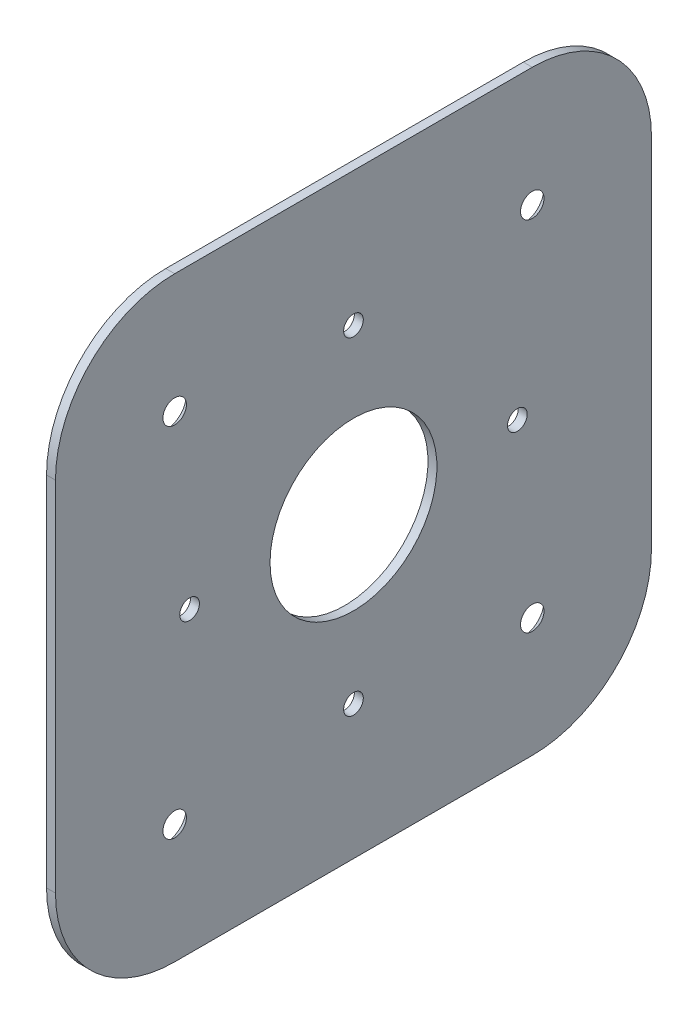
ISO-10303-21;
HEADER;
FILE_DESCRIPTION(('STEP AP214'),'2;1');
FILE_NAME('part.step','',(''),(''),'','','');
FILE_SCHEMA(('AUTOMOTIVE_DESIGN { 1 0 10303 214 1 1 1 1 }'));
ENDSEC;
DATA;
#1=APPLICATION_CONTEXT('core data for automotive mechanical design processes');
#2=APPLICATION_PROTOCOL_DEFINITION('international standard','automotive_design',2000,#1);
#3=PRODUCT_CONTEXT('',#1,'mechanical');
#4=PRODUCT('Part','Part','',(#3));
#5=PRODUCT_RELATED_PRODUCT_CATEGORY('part','',(#4));
#6=PRODUCT_DEFINITION_FORMATION('','',#4);
#7=PRODUCT_DEFINITION_CONTEXT('part definition',#1,'design');
#8=PRODUCT_DEFINITION('design','',#6,#7);
#9=PRODUCT_DEFINITION_SHAPE('','',#8);
#10=(LENGTH_UNIT() NAMED_UNIT(*) SI_UNIT(.MILLI.,.METRE.));
#11=(NAMED_UNIT(*) PLANE_ANGLE_UNIT() SI_UNIT($,.RADIAN.));
#12=(NAMED_UNIT(*) SI_UNIT($,.STERADIAN.) SOLID_ANGLE_UNIT());
#13=UNCERTAINTY_MEASURE_WITH_UNIT(LENGTH_MEASURE(1.E-05),#10,'distance_accuracy_value','');
#14=(GEOMETRIC_REPRESENTATION_CONTEXT(3) GLOBAL_UNCERTAINTY_ASSIGNED_CONTEXT((#13)) GLOBAL_UNIT_ASSIGNED_CONTEXT((#10,
#11,#12)) REPRESENTATION_CONTEXT('',''));
#15=CARTESIAN_POINT('',(0.,0.,0.));
#16=DIRECTION('',(0.,0.,1.));
#17=DIRECTION('',(1.,0.,0.));
#18=AXIS2_PLACEMENT_3D('',#15,#16,#17);
#19=CARTESIAN_POINT('',(0.,-30.,30.));
#20=DIRECTION('',(-1.,0.,0.));
#21=DIRECTION('',(0.,0.,1.));
#22=AXIS2_PLACEMENT_3D('',#19,#20,#21);
#23=PLANE('',#22);
#24=CARTESIAN_POINT('',(0.,2.88047377291524E-13,27.5));
#25=DIRECTION('',(-1.,0.,0.));
#26=DIRECTION('',(0.,0.,1.));
#27=AXIS2_PLACEMENT_3D('',#24,#25,#26);
#28=CIRCLE('',#27,1.65);
#29=CARTESIAN_POINT('',(0.,2.88047377291524E-13,29.15));
#30=VERTEX_POINT('',#29);
#31=EDGE_CURVE('E265',#30,#30,#28,.T.);
#32=ORIENTED_EDGE('',*,*,#31,.T.);
#33=EDGE_LOOP('',(#32));
#34=FACE_BOUND('',#33,.T.);
#35=CARTESIAN_POINT('',(0.,-27.5,0.));
#36=DIRECTION('',(-1.,0.,0.));
#37=DIRECTION('',(0.,0.,1.));
#38=AXIS2_PLACEMENT_3D('',#35,#36,#37);
#39=CIRCLE('',#38,1.65);
#40=CARTESIAN_POINT('',(0.,-27.5,1.65));
#41=VERTEX_POINT('',#40);
#42=EDGE_CURVE('E275',#41,#41,#39,.T.);
#43=ORIENTED_EDGE('',*,*,#42,.T.);
#44=EDGE_LOOP('',(#43));
#45=FACE_BOUND('',#44,.T.);
#46=CARTESIAN_POINT('',(0.,0.,-27.5));
#47=DIRECTION('',(-1.,0.,0.));
#48=DIRECTION('',(0.,0.,1.));
#49=AXIS2_PLACEMENT_3D('',#46,#47,#48);
#50=CIRCLE('',#49,1.65);
#51=CARTESIAN_POINT('',(0.,0.,-25.85));
#52=VERTEX_POINT('',#51);
#53=EDGE_CURVE('E281',#52,#52,#50,.T.);
#54=ORIENTED_EDGE('',*,*,#53,.T.);
#55=EDGE_LOOP('',(#54));
#56=FACE_BOUND('',#55,.T.);
#57=CARTESIAN_POINT('',(0.,27.5,0.));
#58=DIRECTION('',(-1.,0.,0.));
#59=DIRECTION('',(0.,0.,1.));
#60=AXIS2_PLACEMENT_3D('',#57,#58,#59);
#61=CIRCLE('',#60,1.65);
#62=CARTESIAN_POINT('',(0.,27.5,1.65));
#63=VERTEX_POINT('',#62);
#64=EDGE_CURVE('E287',#63,#63,#61,.T.);
#65=ORIENTED_EDGE('',*,*,#64,.T.);
#66=EDGE_LOOP('',(#65));
#67=FACE_BOUND('',#66,.T.);
#68=CARTESIAN_POINT('',(0.,0.,0.));
#69=DIRECTION('',(-1.,0.,0.));
#70=DIRECTION('',(0.,0.,1.));
#71=AXIS2_PLACEMENT_3D('',#68,#69,#70);
#72=CIRCLE('',#71,14.);
#73=CARTESIAN_POINT('',(0.,0.,14.));
#74=VERTEX_POINT('',#73);
#75=EDGE_CURVE('E293',#74,#74,#72,.T.);
#76=ORIENTED_EDGE('',*,*,#75,.T.);
#77=EDGE_LOOP('',(#76));
#78=FACE_BOUND('',#77,.T.);
#79=CARTESIAN_POINT('',(0.,30.,-30.));
#80=DIRECTION('',(-1.,0.,0.));
#81=DIRECTION('',(0.,0.,1.));
#82=AXIS2_PLACEMENT_3D('',#79,#80,#81);
#83=CIRCLE('',#82,1.97);
#84=CARTESIAN_POINT('',(0.,30.,-28.03));
#85=VERTEX_POINT('',#84);
#86=EDGE_CURVE('E298',#85,#85,#83,.T.);
#87=ORIENTED_EDGE('',*,*,#86,.T.);
#88=EDGE_LOOP('',(#87));
#89=FACE_BOUND('',#88,.T.);
#90=CARTESIAN_POINT('',(0.,30.,30.));
#91=DIRECTION('',(-1.,0.,0.));
#92=DIRECTION('',(0.,0.,1.));
#93=AXIS2_PLACEMENT_3D('',#90,#91,#92);
#94=CIRCLE('',#93,1.97);
#95=CARTESIAN_POINT('',(0.,30.,31.97));
#96=VERTEX_POINT('',#95);
#97=EDGE_CURVE('E45',#96,#96,#94,.T.);
#98=ORIENTED_EDGE('',*,*,#97,.T.);
#99=EDGE_LOOP('',(#98));
#100=FACE_BOUND('',#99,.T.);
#101=CARTESIAN_POINT('',(0.,-30.,30.));
#102=DIRECTION('',(1.,0.,0.));
#103=DIRECTION('',(0.,0.,1.));
#104=AXIS2_PLACEMENT_3D('',#101,#102,#103);
#105=CIRCLE('',#104,20.);
#106=CARTESIAN_POINT('',(0.,-29.9999999999999,50.));
#107=VERTEX_POINT('',#106);
#108=CARTESIAN_POINT('',(0.,-50.,29.9999999999999));
#109=VERTEX_POINT('',#108);
#110=EDGE_CURVE('E140',#107,#109,#105,.T.);
#111=ORIENTED_EDGE('',*,*,#110,.T.);
#112=DIRECTION('',(0.,0.,-1.));
#113=VECTOR('',#112,1.);
#114=CARTESIAN_POINT('',(0.,-50.,29.9999999999999));
#115=LINE('',#114,#113);
#116=CARTESIAN_POINT('',(0.,-50.,-29.9999999999999));
#117=VERTEX_POINT('',#116);
#118=EDGE_CURVE('E143',#109,#117,#115,.T.);
#119=ORIENTED_EDGE('',*,*,#118,.T.);
#120=CARTESIAN_POINT('',(0.,-30.,-30.));
#121=DIRECTION('',(1.,0.,0.));
#122=DIRECTION('',(0.,0.,-1.));
#123=AXIS2_PLACEMENT_3D('',#120,#121,#122);
#124=CIRCLE('',#123,20.);
#125=CARTESIAN_POINT('',(0.,-29.9999999999999,-50.));
#126=VERTEX_POINT('',#125);
#127=EDGE_CURVE('E147',#117,#126,#124,.T.);
#128=ORIENTED_EDGE('',*,*,#127,.T.);
#129=DIRECTION('',(0.,1.,0.));
#130=VECTOR('',#129,1.);
#131=CARTESIAN_POINT('',(0.,-29.9999999999999,-50.));
#132=LINE('',#131,#130);
#133=CARTESIAN_POINT('',(0.,29.9999999999998,-50.));
#134=VERTEX_POINT('',#133);
#135=EDGE_CURVE('E150',#126,#134,#132,.T.);
#136=ORIENTED_EDGE('',*,*,#135,.T.);
#137=CARTESIAN_POINT('',(0.,30.,-30.));
#138=DIRECTION('',(1.,0.,0.));
#139=DIRECTION('',(0.,0.,1.));
#140=AXIS2_PLACEMENT_3D('',#137,#138,#139);
#141=CIRCLE('',#140,20.);
#142=CARTESIAN_POINT('',(0.,50.,-29.9999999999999));
#143=VERTEX_POINT('',#142);
#144=EDGE_CURVE('E153',#134,#143,#141,.T.);
#145=ORIENTED_EDGE('',*,*,#144,.T.);
#146=DIRECTION('',(0.,0.,1.));
#147=VECTOR('',#146,1.);
#148=CARTESIAN_POINT('',(0.,50.,29.9999999999999));
#149=LINE('',#148,#147);
#150=CARTESIAN_POINT('',(0.,50.,29.9999999999999));
#151=VERTEX_POINT('',#150);
#152=EDGE_CURVE('E156',#143,#151,#149,.T.);
#153=ORIENTED_EDGE('',*,*,#152,.T.);
#154=CARTESIAN_POINT('',(0.,30.,30.));
#155=DIRECTION('',(1.,0.,0.));
#156=DIRECTION('',(0.,0.,1.));
#157=AXIS2_PLACEMENT_3D('',#154,#155,#156);
#158=CIRCLE('',#157,20.);
#159=CARTESIAN_POINT('',(0.,29.9999999999999,50.));
#160=VERTEX_POINT('',#159);
#161=EDGE_CURVE('E117',#151,#160,#158,.T.);
#162=ORIENTED_EDGE('',*,*,#161,.T.);
#163=DIRECTION('',(0.,-1.,0.));
#164=VECTOR('',#163,1.);
#165=CARTESIAN_POINT('',(0.,-29.9999999999999,50.));
#166=LINE('',#165,#164);
#167=EDGE_CURVE('E159',#160,#107,#166,.T.);
#168=ORIENTED_EDGE('',*,*,#167,.T.);
#169=EDGE_LOOP('',(#111,#119,#128,#136,#145,#153,#162,#168));
#170=FACE_BOUND('',#169,.T.);
#171=CARTESIAN_POINT('',(0.,-30.,-30.));
#172=DIRECTION('',(-1.,0.,0.));
#173=DIRECTION('',(0.,0.,1.));
#174=AXIS2_PLACEMENT_3D('',#171,#172,#173);
#175=CIRCLE('',#174,1.97);
#176=CARTESIAN_POINT('',(0.,-30.,-28.03));
#177=VERTEX_POINT('',#176);
#178=EDGE_CURVE('E144',#177,#177,#175,.T.);
#179=ORIENTED_EDGE('',*,*,#178,.T.);
#180=EDGE_LOOP('',(#179));
#181=FACE_BOUND('',#180,.T.);
#182=CARTESIAN_POINT('',(0.,-30.,30.));
#183=DIRECTION('',(-1.,0.,0.));
#184=DIRECTION('',(0.,0.,1.));
#185=AXIS2_PLACEMENT_3D('',#182,#183,#184);
#186=CIRCLE('',#185,1.97);
#187=CARTESIAN_POINT('',(0.,-30.,31.97));
#188=VERTEX_POINT('',#187);
#189=EDGE_CURVE('E174',#188,#188,#186,.T.);
#190=ORIENTED_EDGE('',*,*,#189,.T.);
#191=EDGE_LOOP('',(#190));
#192=FACE_BOUND('',#191,.T.);
#193=ADVANCED_FACE('F41',(#34,#45,#56,#67,#78,#89,#100,#170,#181,#192),#23,.F.);
#194=CARTESIAN_POINT('',(-1.5,-30.,30.));
#195=DIRECTION('',(1.,0.,0.));
#196=DIRECTION('',(0.,0.,-1.));
#197=AXIS2_PLACEMENT_3D('',#194,#195,#196);
#198=CYLINDRICAL_SURFACE('',#197,20.);
#199=ORIENTED_EDGE('',*,*,#110,.F.);
#200=DIRECTION('',(1.,0.,0.));
#201=VECTOR('',#200,1.);
#202=CARTESIAN_POINT('',(-1.5,-29.9999999999999,50.));
#203=LINE('',#202,#201);
#204=CARTESIAN_POINT('',(-1.5,-29.9999999999999,50.));
#205=VERTEX_POINT('',#204);
#206=EDGE_CURVE('E11',#205,#107,#203,.T.);
#207=ORIENTED_EDGE('',*,*,#206,.F.);
#208=CARTESIAN_POINT('',(-1.5,-30.,30.));
#209=DIRECTION('',(1.,0.,0.));
#210=DIRECTION('',(0.,0.,1.));
#211=AXIS2_PLACEMENT_3D('',#208,#209,#210);
#212=CIRCLE('',#211,20.);
#213=CARTESIAN_POINT('',(-1.5,-50.,29.9999999999999));
#214=VERTEX_POINT('',#213);
#215=EDGE_CURVE('E161',#205,#214,#212,.T.);
#216=ORIENTED_EDGE('',*,*,#215,.T.);
#217=DIRECTION('',(1.,0.,0.));
#218=VECTOR('',#217,1.);
#219=CARTESIAN_POINT('',(-1.5,-50.,29.9999999999999));
#220=LINE('',#219,#218);
#221=EDGE_CURVE('E98',#214,#109,#220,.T.);
#222=ORIENTED_EDGE('',*,*,#221,.T.);
#223=EDGE_LOOP('',(#199,#207,#216,#222));
#224=FACE_BOUND('',#223,.T.);
#225=ADVANCED_FACE('F43',(#224),#198,.T.);
#226=CARTESIAN_POINT('',(-1.5,-29.9999999999999,50.));
#227=DIRECTION('',(0.,0.,1.));
#228=DIRECTION('',(1.,0.,0.));
#229=AXIS2_PLACEMENT_3D('',#226,#227,#228);
#230=PLANE('',#229);
#231=ORIENTED_EDGE('',*,*,#167,.F.);
#232=DIRECTION('',(1.,0.,0.));
#233=VECTOR('',#232,1.);
#234=CARTESIAN_POINT('',(-1.5,29.9999999999999,50.));
#235=LINE('',#234,#233);
#236=CARTESIAN_POINT('',(-1.5,29.9999999999999,50.));
#237=VERTEX_POINT('',#236);
#238=EDGE_CURVE('E51',#237,#160,#235,.T.);
#239=ORIENTED_EDGE('',*,*,#238,.F.);
#240=DIRECTION('',(0.,-1.,0.));
#241=VECTOR('',#240,1.);
#242=CARTESIAN_POINT('',(-1.5,-29.9999999999999,50.));
#243=LINE('',#242,#241);
#244=EDGE_CURVE('E130',#237,#205,#243,.T.);
#245=ORIENTED_EDGE('',*,*,#244,.T.);
#246=ORIENTED_EDGE('',*,*,#206,.T.);
#247=EDGE_LOOP('',(#231,#239,#245,#246));
#248=FACE_BOUND('',#247,.T.);
#249=ADVANCED_FACE('F208',(#248),#230,.T.);
#250=CARTESIAN_POINT('',(-1.5,30.,30.));
#251=DIRECTION('',(1.,0.,0.));
#252=DIRECTION('',(0.,0.,-1.));
#253=AXIS2_PLACEMENT_3D('',#250,#251,#252);
#254=CYLINDRICAL_SURFACE('',#253,20.);
#255=ORIENTED_EDGE('',*,*,#161,.F.);
#256=DIRECTION('',(1.,0.,0.));
#257=VECTOR('',#256,1.);
#258=CARTESIAN_POINT('',(-1.5,50.,29.9999999999999));
#259=LINE('',#258,#257);
#260=CARTESIAN_POINT('',(-1.5,50.,29.9999999999999));
#261=VERTEX_POINT('',#260);
#262=EDGE_CURVE('E112',#261,#151,#259,.T.);
#263=ORIENTED_EDGE('',*,*,#262,.F.);
#264=CARTESIAN_POINT('',(-1.5,30.,30.));
#265=DIRECTION('',(1.,0.,0.));
#266=DIRECTION('',(0.,0.,1.));
#267=AXIS2_PLACEMENT_3D('',#264,#265,#266);
#268=CIRCLE('',#267,20.);
#269=EDGE_CURVE('E115',#261,#237,#268,.T.);
#270=ORIENTED_EDGE('',*,*,#269,.T.);
#271=ORIENTED_EDGE('',*,*,#238,.T.);
#272=EDGE_LOOP('',(#255,#263,#270,#271));
#273=FACE_BOUND('',#272,.T.);
#274=ADVANCED_FACE('F114',(#273),#254,.T.);
#275=CARTESIAN_POINT('',(-1.5,50.,29.9999999999999));
#276=DIRECTION('',(0.,1.,0.));
#277=DIRECTION('',(0.,0.,1.));
#278=AXIS2_PLACEMENT_3D('',#275,#276,#277);
#279=PLANE('',#278);
#280=ORIENTED_EDGE('',*,*,#152,.F.);
#281=DIRECTION('',(1.,0.,0.));
#282=VECTOR('',#281,1.);
#283=CARTESIAN_POINT('',(-1.5,50.,-29.9999999999999));
#284=LINE('',#283,#282);
#285=CARTESIAN_POINT('',(-1.5,50.,-29.9999999999999));
#286=VERTEX_POINT('',#285);
#287=EDGE_CURVE('E122',#286,#143,#284,.T.);
#288=ORIENTED_EDGE('',*,*,#287,.F.);
#289=DIRECTION('',(0.,0.,1.));
#290=VECTOR('',#289,1.);
#291=CARTESIAN_POINT('',(-1.5,50.,29.9999999999999));
#292=LINE('',#291,#290);
#293=EDGE_CURVE('E128',#286,#261,#292,.T.);
#294=ORIENTED_EDGE('',*,*,#293,.T.);
#295=ORIENTED_EDGE('',*,*,#262,.T.);
#296=EDGE_LOOP('',(#280,#288,#294,#295));
#297=FACE_BOUND('',#296,.T.);
#298=ADVANCED_FACE('F132',(#297),#279,.T.);
#299=CARTESIAN_POINT('',(-1.5,30.,-30.));
#300=DIRECTION('',(1.,0.,0.));
#301=DIRECTION('',(0.,0.,-1.));
#302=AXIS2_PLACEMENT_3D('',#299,#300,#301);
#303=CYLINDRICAL_SURFACE('',#302,20.);
#304=ORIENTED_EDGE('',*,*,#144,.F.);
#305=DIRECTION('',(1.,0.,0.));
#306=VECTOR('',#305,1.);
#307=CARTESIAN_POINT('',(-1.5,29.9999999999998,-50.));
#308=LINE('',#307,#306);
#309=CARTESIAN_POINT('',(-1.5,29.9999999999998,-50.));
#310=VERTEX_POINT('',#309);
#311=EDGE_CURVE('E165',#310,#134,#308,.T.);
#312=ORIENTED_EDGE('',*,*,#311,.F.);
#313=CARTESIAN_POINT('',(-1.5,30.,-30.));
#314=DIRECTION('',(1.,0.,0.));
#315=DIRECTION('',(0.,0.,1.));
#316=AXIS2_PLACEMENT_3D('',#313,#314,#315);
#317=CIRCLE('',#316,20.);
#318=EDGE_CURVE('E133',#310,#286,#317,.T.);
#319=ORIENTED_EDGE('',*,*,#318,.T.);
#320=ORIENTED_EDGE('',*,*,#287,.T.);
#321=EDGE_LOOP('',(#304,#312,#319,#320));
#322=FACE_BOUND('',#321,.T.);
#323=ADVANCED_FACE('F388',(#322),#303,.T.);
#324=CARTESIAN_POINT('',(-1.5,-29.9999999999999,-50.));
#325=DIRECTION('',(0.,0.,-1.));
#326=DIRECTION('',(-1.,0.,0.));
#327=AXIS2_PLACEMENT_3D('',#324,#325,#326);
#328=PLANE('',#327);
#329=ORIENTED_EDGE('',*,*,#135,.F.);
#330=DIRECTION('',(1.,0.,0.));
#331=VECTOR('',#330,1.);
#332=CARTESIAN_POINT('',(-1.5,-29.9999999999999,-50.));
#333=LINE('',#332,#331);
#334=CARTESIAN_POINT('',(-1.5,-29.9999999999999,-50.));
#335=VERTEX_POINT('',#334);
#336=EDGE_CURVE('E167',#335,#126,#333,.T.);
#337=ORIENTED_EDGE('',*,*,#336,.F.);
#338=DIRECTION('',(0.,1.,0.));
#339=VECTOR('',#338,1.);
#340=CARTESIAN_POINT('',(-1.5,-29.9999999999999,-50.));
#341=LINE('',#340,#339);
#342=EDGE_CURVE('E135',#335,#310,#341,.T.);
#343=ORIENTED_EDGE('',*,*,#342,.T.);
#344=ORIENTED_EDGE('',*,*,#311,.T.);
#345=EDGE_LOOP('',(#329,#337,#343,#344));
#346=FACE_BOUND('',#345,.T.);
#347=ADVANCED_FACE('F199',(#346),#328,.T.);
#348=CARTESIAN_POINT('',(-1.5,-30.,-30.));
#349=DIRECTION('',(1.,0.,0.));
#350=DIRECTION('',(0.,0.,-1.));
#351=AXIS2_PLACEMENT_3D('',#348,#349,#350);
#352=CYLINDRICAL_SURFACE('',#351,20.);
#353=ORIENTED_EDGE('',*,*,#127,.F.);
#354=DIRECTION('',(1.,0.,0.));
#355=VECTOR('',#354,1.);
#356=CARTESIAN_POINT('',(-1.5,-50.,-29.9999999999999));
#357=LINE('',#356,#355);
#358=CARTESIAN_POINT('',(-1.5,-50.,-29.9999999999999));
#359=VERTEX_POINT('',#358);
#360=EDGE_CURVE('E169',#359,#117,#357,.T.);
#361=ORIENTED_EDGE('',*,*,#360,.F.);
#362=CARTESIAN_POINT('',(-1.5,-30.,-30.));
#363=DIRECTION('',(1.,0.,0.));
#364=DIRECTION('',(0.,0.,-1.));
#365=AXIS2_PLACEMENT_3D('',#362,#363,#364);
#366=CIRCLE('',#365,20.);
#367=EDGE_CURVE('E193',#359,#335,#366,.T.);
#368=ORIENTED_EDGE('',*,*,#367,.T.);
#369=ORIENTED_EDGE('',*,*,#336,.T.);
#370=EDGE_LOOP('',(#353,#361,#368,#369));
#371=FACE_BOUND('',#370,.T.);
#372=ADVANCED_FACE('F204',(#371),#352,.T.);
#373=CARTESIAN_POINT('',(-1.5,-50.,29.9999999999999));
#374=DIRECTION('',(0.,-1.,0.));
#375=DIRECTION('',(0.,0.,-1.));
#376=AXIS2_PLACEMENT_3D('',#373,#374,#375);
#377=PLANE('',#376);
#378=ORIENTED_EDGE('',*,*,#118,.F.);
#379=ORIENTED_EDGE('',*,*,#221,.F.);
#380=DIRECTION('',(0.,0.,-1.));
#381=VECTOR('',#380,1.);
#382=CARTESIAN_POINT('',(-1.5,-50.,29.9999999999999));
#383=LINE('',#382,#381);
#384=EDGE_CURVE('E191',#214,#359,#383,.T.);
#385=ORIENTED_EDGE('',*,*,#384,.T.);
#386=ORIENTED_EDGE('',*,*,#360,.T.);
#387=EDGE_LOOP('',(#378,#379,#385,#386));
#388=FACE_BOUND('',#387,.T.);
#389=ADVANCED_FACE('F205',(#388),#377,.T.);
#390=CARTESIAN_POINT('',(-1.5,-30.,30.));
#391=DIRECTION('',(-1.,0.,0.));
#392=DIRECTION('',(0.,0.,1.));
#393=AXIS2_PLACEMENT_3D('',#390,#391,#392);
#394=PLANE('',#393);
#395=CARTESIAN_POINT('',(-1.5,2.88047377291524E-13,27.5));
#396=DIRECTION('',(-1.,0.,0.));
#397=DIRECTION('',(0.,0.,1.));
#398=AXIS2_PLACEMENT_3D('',#395,#396,#397);
#399=CIRCLE('',#398,1.64999999999999);
#400=CARTESIAN_POINT('',(-1.5,2.88047377291524E-13,29.15));
#401=VERTEX_POINT('',#400);
#402=EDGE_CURVE('E268',#401,#401,#399,.T.);
#403=ORIENTED_EDGE('',*,*,#402,.F.);
#404=EDGE_LOOP('',(#403));
#405=FACE_BOUND('',#404,.T.);
#406=CARTESIAN_POINT('',(-1.5,-27.5,0.));
#407=DIRECTION('',(-1.,0.,0.));
#408=DIRECTION('',(0.,0.,1.));
#409=AXIS2_PLACEMENT_3D('',#406,#407,#408);
#410=CIRCLE('',#409,1.64999999999999);
#411=CARTESIAN_POINT('',(-1.5,-27.5,1.64999999999999));
#412=VERTEX_POINT('',#411);
#413=EDGE_CURVE('E270',#412,#412,#410,.T.);
#414=ORIENTED_EDGE('',*,*,#413,.F.);
#415=EDGE_LOOP('',(#414));
#416=FACE_BOUND('',#415,.T.);
#417=CARTESIAN_POINT('',(-1.5,0.,-27.5));
#418=DIRECTION('',(-1.,0.,0.));
#419=DIRECTION('',(0.,0.,1.));
#420=AXIS2_PLACEMENT_3D('',#417,#418,#419);
#421=CIRCLE('',#420,1.64999999999999);
#422=CARTESIAN_POINT('',(-1.5,0.,-25.85));
#423=VERTEX_POINT('',#422);
#424=EDGE_CURVE('E278',#423,#423,#421,.T.);
#425=ORIENTED_EDGE('',*,*,#424,.F.);
#426=EDGE_LOOP('',(#425));
#427=FACE_BOUND('',#426,.T.);
#428=CARTESIAN_POINT('',(-1.5,27.5,0.));
#429=DIRECTION('',(-1.,0.,0.));
#430=DIRECTION('',(0.,0.,1.));
#431=AXIS2_PLACEMENT_3D('',#428,#429,#430);
#432=CIRCLE('',#431,1.64999999999999);
#433=CARTESIAN_POINT('',(-1.5,27.5,1.64999999999999));
#434=VERTEX_POINT('',#433);
#435=EDGE_CURVE('E284',#434,#434,#432,.T.);
#436=ORIENTED_EDGE('',*,*,#435,.F.);
#437=EDGE_LOOP('',(#436));
#438=FACE_BOUND('',#437,.T.);
#439=CARTESIAN_POINT('',(-1.5,0.,0.));
#440=DIRECTION('',(-1.,0.,0.));
#441=DIRECTION('',(0.,0.,1.));
#442=AXIS2_PLACEMENT_3D('',#439,#440,#441);
#443=CIRCLE('',#442,14.);
#444=CARTESIAN_POINT('',(-1.5,0.,14.));
#445=VERTEX_POINT('',#444);
#446=EDGE_CURVE('E290',#445,#445,#443,.T.);
#447=ORIENTED_EDGE('',*,*,#446,.F.);
#448=EDGE_LOOP('',(#447));
#449=FACE_BOUND('',#448,.T.);
#450=CARTESIAN_POINT('',(-1.5,30.,-30.));
#451=DIRECTION('',(-1.,0.,0.));
#452=DIRECTION('',(0.,0.,1.));
#453=AXIS2_PLACEMENT_3D('',#450,#451,#452);
#454=CIRCLE('',#453,3.47);
#455=CARTESIAN_POINT('',(-1.5,30.,-26.53));
#456=VERTEX_POINT('',#455);
#457=EDGE_CURVE('E296',#456,#456,#454,.T.);
#458=ORIENTED_EDGE('',*,*,#457,.F.);
#459=EDGE_LOOP('',(#458));
#460=FACE_BOUND('',#459,.T.);
#461=CARTESIAN_POINT('',(-1.5,30.,30.));
#462=DIRECTION('',(-1.,0.,0.));
#463=DIRECTION('',(0.,0.,1.));
#464=AXIS2_PLACEMENT_3D('',#461,#462,#463);
#465=CIRCLE('',#464,3.47);
#466=CARTESIAN_POINT('',(-1.5,30.,33.47));
#467=VERTEX_POINT('',#466);
#468=EDGE_CURVE('E186',#467,#467,#465,.T.);
#469=ORIENTED_EDGE('',*,*,#468,.F.);
#470=EDGE_LOOP('',(#469));
#471=FACE_BOUND('',#470,.T.);
#472=CARTESIAN_POINT('',(-1.5,-30.,30.));
#473=DIRECTION('',(-1.,0.,0.));
#474=DIRECTION('',(0.,0.,1.));
#475=AXIS2_PLACEMENT_3D('',#472,#473,#474);
#476=CIRCLE('',#475,3.47);
#477=CARTESIAN_POINT('',(-1.5,-30.,33.47));
#478=VERTEX_POINT('',#477);
#479=EDGE_CURVE('E176',#478,#478,#476,.T.);
#480=ORIENTED_EDGE('',*,*,#479,.F.);
#481=EDGE_LOOP('',(#480));
#482=FACE_BOUND('',#481,.T.);
#483=CARTESIAN_POINT('',(-1.5,-30.,-30.));
#484=DIRECTION('',(-1.,0.,0.));
#485=DIRECTION('',(0.,0.,1.));
#486=AXIS2_PLACEMENT_3D('',#483,#484,#485);
#487=CIRCLE('',#486,3.47);
#488=CARTESIAN_POINT('',(-1.5,-30.,-26.53));
#489=VERTEX_POINT('',#488);
#490=EDGE_CURVE('E173',#489,#489,#487,.T.);
#491=ORIENTED_EDGE('',*,*,#490,.F.);
#492=EDGE_LOOP('',(#491));
#493=FACE_BOUND('',#492,.T.);
#494=ORIENTED_EDGE('',*,*,#215,.F.);
#495=ORIENTED_EDGE('',*,*,#244,.F.);
#496=ORIENTED_EDGE('',*,*,#269,.F.);
#497=ORIENTED_EDGE('',*,*,#293,.F.);
#498=ORIENTED_EDGE('',*,*,#318,.F.);
#499=ORIENTED_EDGE('',*,*,#342,.F.);
#500=ORIENTED_EDGE('',*,*,#367,.F.);
#501=ORIENTED_EDGE('',*,*,#384,.F.);
#502=EDGE_LOOP('',(#494,#495,#496,#497,#498,#499,#500,#501));
#503=FACE_BOUND('',#502,.T.);
#504=ADVANCED_FACE('F126',(#405,#416,#427,#438,#449,#460,#471,#482,#493,#503),#394,.T.);
#505=CARTESIAN_POINT('',(-1.5,-30.,-30.));
#506=DIRECTION('',(-1.,0.,0.));
#507=DIRECTION('',(0.,0.,1.));
#508=AXIS2_PLACEMENT_3D('',#505,#506,#507);
#509=CONICAL_SURFACE('',#508,3.47,0.785398163397448);
#510=ORIENTED_EDGE('',*,*,#490,.T.);
#511=EDGE_LOOP('',(#510));
#512=FACE_BOUND('',#511,.T.);
#513=ORIENTED_EDGE('',*,*,#178,.F.);
#514=EDGE_LOOP('',(#513));
#515=FACE_BOUND('',#514,.T.);
#516=ADVANCED_FACE('F226',(#512,#515),#509,.F.);
#517=CARTESIAN_POINT('',(-1.5,-30.,30.));
#518=DIRECTION('',(-1.,0.,0.));
#519=DIRECTION('',(0.,0.,1.));
#520=AXIS2_PLACEMENT_3D('',#517,#518,#519);
#521=CONICAL_SURFACE('',#520,3.47,0.785398163397448);
#522=ORIENTED_EDGE('',*,*,#479,.T.);
#523=EDGE_LOOP('',(#522));
#524=FACE_BOUND('',#523,.T.);
#525=ORIENTED_EDGE('',*,*,#189,.F.);
#526=EDGE_LOOP('',(#525));
#527=FACE_BOUND('',#526,.T.);
#528=ADVANCED_FACE('F230',(#524,#527),#521,.F.);
#529=CARTESIAN_POINT('',(-1.5,30.,30.));
#530=DIRECTION('',(-1.,0.,0.));
#531=DIRECTION('',(0.,0.,1.));
#532=AXIS2_PLACEMENT_3D('',#529,#530,#531);
#533=CONICAL_SURFACE('',#532,3.47,0.785398163397448);
#534=ORIENTED_EDGE('',*,*,#468,.T.);
#535=EDGE_LOOP('',(#534));
#536=FACE_BOUND('',#535,.T.);
#537=ORIENTED_EDGE('',*,*,#97,.F.);
#538=EDGE_LOOP('',(#537));
#539=FACE_BOUND('',#538,.T.);
#540=ADVANCED_FACE('F234',(#536,#539),#533,.F.);
#541=CARTESIAN_POINT('',(-1.5,30.,-30.));
#542=DIRECTION('',(-1.,0.,0.));
#543=DIRECTION('',(0.,0.,1.));
#544=AXIS2_PLACEMENT_3D('',#541,#542,#543);
#545=CONICAL_SURFACE('',#544,3.47,0.785398163397448);
#546=ORIENTED_EDGE('',*,*,#457,.T.);
#547=EDGE_LOOP('',(#546));
#548=FACE_BOUND('',#547,.T.);
#549=ORIENTED_EDGE('',*,*,#86,.F.);
#550=EDGE_LOOP('',(#549));
#551=FACE_BOUND('',#550,.T.);
#552=ADVANCED_FACE('F237',(#548,#551),#545,.F.);
#553=CARTESIAN_POINT('',(-1.5,0.,0.));
#554=DIRECTION('',(-1.,0.,0.));
#555=DIRECTION('',(0.,0.,1.));
#556=AXIS2_PLACEMENT_3D('',#553,#554,#555);
#557=CYLINDRICAL_SURFACE('',#556,14.);
#558=ORIENTED_EDGE('',*,*,#446,.T.);
#559=EDGE_LOOP('',(#558));
#560=FACE_BOUND('',#559,.T.);
#561=ORIENTED_EDGE('',*,*,#75,.F.);
#562=EDGE_LOOP('',(#561));
#563=FACE_BOUND('',#562,.T.);
#564=ADVANCED_FACE('F241',(#560,#563),#557,.F.);
#565=CARTESIAN_POINT('',(-1.5,27.5,0.));
#566=DIRECTION('',(-1.,0.,0.));
#567=DIRECTION('',(0.,0.,1.));
#568=AXIS2_PLACEMENT_3D('',#565,#566,#567);
#569=CYLINDRICAL_SURFACE('',#568,1.64999999999999);
#570=ORIENTED_EDGE('',*,*,#64,.F.);
#571=EDGE_LOOP('',(#570));
#572=FACE_BOUND('',#571,.T.);
#573=ORIENTED_EDGE('',*,*,#435,.T.);
#574=EDGE_LOOP('',(#573));
#575=FACE_BOUND('',#574,.T.);
#576=ADVANCED_FACE('F245',(#572,#575),#569,.F.);
#577=CARTESIAN_POINT('',(-1.5,0.,-27.5));
#578=DIRECTION('',(-1.,0.,0.));
#579=DIRECTION('',(0.,0.,1.));
#580=AXIS2_PLACEMENT_3D('',#577,#578,#579);
#581=CYLINDRICAL_SURFACE('',#580,1.64999999999999);
#582=ORIENTED_EDGE('',*,*,#53,.F.);
#583=EDGE_LOOP('',(#582));
#584=FACE_BOUND('',#583,.T.);
#585=ORIENTED_EDGE('',*,*,#424,.T.);
#586=EDGE_LOOP('',(#585));
#587=FACE_BOUND('',#586,.T.);
#588=ADVANCED_FACE('F249',(#584,#587),#581,.F.);
#589=CARTESIAN_POINT('',(-1.5,-27.5,0.));
#590=DIRECTION('',(-1.,0.,0.));
#591=DIRECTION('',(0.,0.,1.));
#592=AXIS2_PLACEMENT_3D('',#589,#590,#591);
#593=CYLINDRICAL_SURFACE('',#592,1.64999999999999);
#594=ORIENTED_EDGE('',*,*,#42,.F.);
#595=EDGE_LOOP('',(#594));
#596=FACE_BOUND('',#595,.T.);
#597=ORIENTED_EDGE('',*,*,#413,.T.);
#598=EDGE_LOOP('',(#597));
#599=FACE_BOUND('',#598,.T.);
#600=ADVANCED_FACE('F253',(#596,#599),#593,.F.);
#601=CARTESIAN_POINT('',(-1.5,2.88047377291524E-13,27.5));
#602=DIRECTION('',(-1.,0.,0.));
#603=DIRECTION('',(0.,0.,1.));
#604=AXIS2_PLACEMENT_3D('',#601,#602,#603);
#605=CYLINDRICAL_SURFACE('',#604,1.64999999999999);
#606=ORIENTED_EDGE('',*,*,#31,.F.);
#607=EDGE_LOOP('',(#606));
#608=FACE_BOUND('',#607,.T.);
#609=ORIENTED_EDGE('',*,*,#402,.T.);
#610=EDGE_LOOP('',(#609));
#611=FACE_BOUND('',#610,.T.);
#612=ADVANCED_FACE('F257',(#608,#611),#605,.F.);
#613=CLOSED_SHELL('',(#193,#225,#249,#274,#298,#323,#347,#372,#389,#504,#516,#528,#540,#552,
#564,#576,#588,#600,#612));
#614=MANIFOLD_SOLID_BREP('B2',#613);
#615=ADVANCED_BREP_SHAPE_REPRESENTATION('',(#18,#614),#14);
#616=SHAPE_DEFINITION_REPRESENTATION(#9,#615);
ENDSEC;
END-ISO-10303-21;
